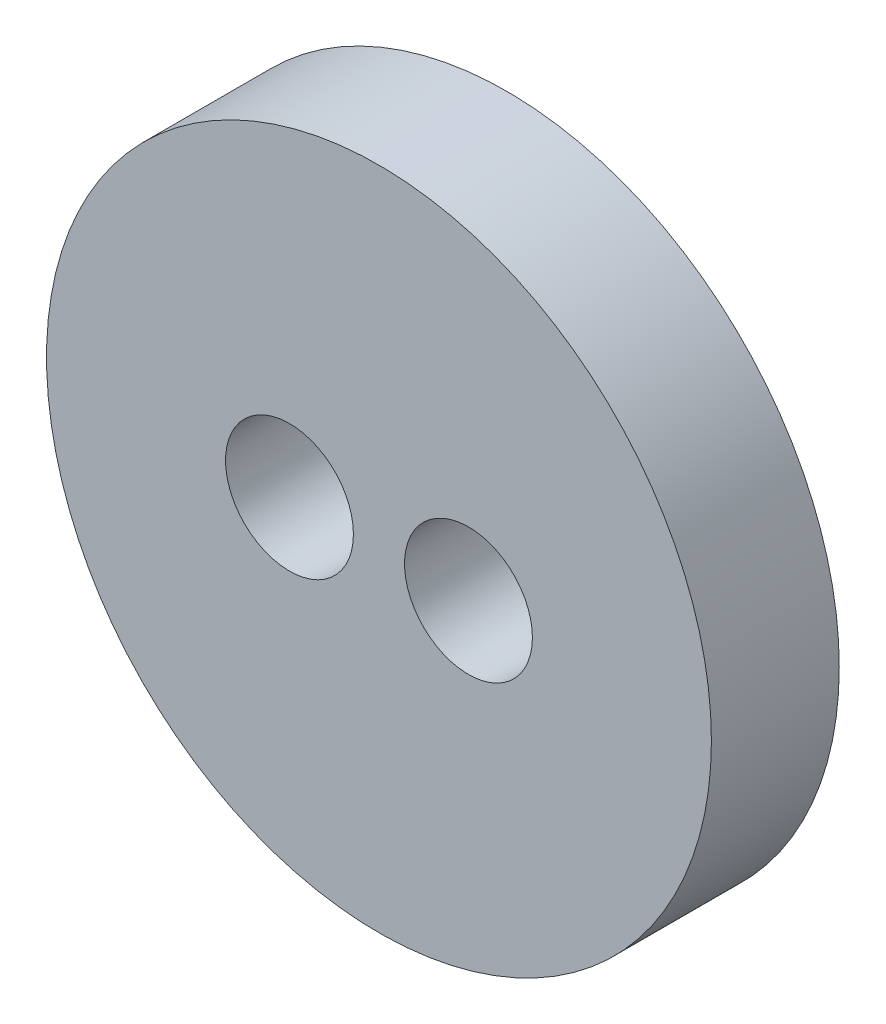
ISO-10303-21;
HEADER;
FILE_DESCRIPTION(('STEP AP214'),'2;1');
FILE_NAME('part.step','',(''),(''),'','','');
FILE_SCHEMA(('AUTOMOTIVE_DESIGN { 1 0 10303 214 1 1 1 1 }'));
ENDSEC;
DATA;
#1=APPLICATION_CONTEXT('core data for automotive mechanical design processes');
#2=APPLICATION_PROTOCOL_DEFINITION('international standard','automotive_design',2000,#1);
#3=PRODUCT_CONTEXT('',#1,'mechanical');
#4=PRODUCT('Part','Part','',(#3));
#5=PRODUCT_RELATED_PRODUCT_CATEGORY('part','',(#4));
#6=PRODUCT_DEFINITION_FORMATION('','',#4);
#7=PRODUCT_DEFINITION_CONTEXT('part definition',#1,'design');
#8=PRODUCT_DEFINITION('design','',#6,#7);
#9=PRODUCT_DEFINITION_SHAPE('','',#8);
#10=(LENGTH_UNIT() NAMED_UNIT(*) SI_UNIT(.MILLI.,.METRE.));
#11=(NAMED_UNIT(*) PLANE_ANGLE_UNIT() SI_UNIT($,.RADIAN.));
#12=(NAMED_UNIT(*) SI_UNIT($,.STERADIAN.) SOLID_ANGLE_UNIT());
#13=UNCERTAINTY_MEASURE_WITH_UNIT(LENGTH_MEASURE(1.E-05),#10,'distance_accuracy_value','');
#14=(GEOMETRIC_REPRESENTATION_CONTEXT(3) GLOBAL_UNCERTAINTY_ASSIGNED_CONTEXT((#13)) GLOBAL_UNIT_ASSIGNED_CONTEXT((#10,
#11,#12)) REPRESENTATION_CONTEXT('',''));
#15=CARTESIAN_POINT('',(0.,0.,0.));
#16=DIRECTION('',(0.,0.,1.));
#17=DIRECTION('',(1.,0.,0.));
#18=AXIS2_PLACEMENT_3D('',#15,#16,#17);
#19=CARTESIAN_POINT('',(0.,0.,2.));
#20=DIRECTION('',(0.,0.,1.));
#21=DIRECTION('',(1.,0.,0.));
#22=AXIS2_PLACEMENT_3D('',#19,#20,#21);
#23=PLANE('',#22);
#24=CARTESIAN_POINT('',(1.4,0.,2.));
#25=DIRECTION('',(0.,0.,1.));
#26=DIRECTION('',(1.,0.,0.));
#27=AXIS2_PLACEMENT_3D('',#24,#25,#26);
#28=CIRCLE('',#27,1.);
#29=CARTESIAN_POINT('',(2.4,0.,2.));
#30=VERTEX_POINT('',#29);
#31=EDGE_CURVE('E52',#30,#30,#28,.T.);
#32=ORIENTED_EDGE('',*,*,#31,.F.);
#33=EDGE_LOOP('',(#32));
#34=FACE_BOUND('',#33,.T.);
#35=CARTESIAN_POINT('',(0.,0.,2.));
#36=DIRECTION('',(0.,0.,1.));
#37=DIRECTION('',(1.,0.,0.));
#38=AXIS2_PLACEMENT_3D('',#35,#36,#37);
#39=CIRCLE('',#38,5.2);
#40=CARTESIAN_POINT('',(5.2,0.,2.));
#41=VERTEX_POINT('',#40);
#42=EDGE_CURVE('E10',#41,#41,#39,.T.);
#43=ORIENTED_EDGE('',*,*,#42,.T.);
#44=EDGE_LOOP('',(#43));
#45=FACE_BOUND('',#44,.T.);
#46=CARTESIAN_POINT('',(-1.4,0.,2.));
#47=DIRECTION('',(0.,0.,1.));
#48=DIRECTION('',(1.,0.,0.));
#49=AXIS2_PLACEMENT_3D('',#46,#47,#48);
#50=CIRCLE('',#49,1.);
#51=CARTESIAN_POINT('',(-0.4,0.,2.));
#52=VERTEX_POINT('',#51);
#53=EDGE_CURVE('E57',#52,#52,#50,.T.);
#54=ORIENTED_EDGE('',*,*,#53,.F.);
#55=EDGE_LOOP('',(#54));
#56=FACE_BOUND('',#55,.T.);
#57=ADVANCED_FACE('F41',(#34,#45,#56),#23,.T.);
#58=CARTESIAN_POINT('',(0.,0.,0.));
#59=DIRECTION('',(0.,0.,1.));
#60=DIRECTION('',(1.,0.,0.));
#61=AXIS2_PLACEMENT_3D('',#58,#59,#60);
#62=PLANE('',#61);
#63=CARTESIAN_POINT('',(0.,0.,0.));
#64=DIRECTION('',(0.,0.,1.));
#65=DIRECTION('',(1.,0.,0.));
#66=AXIS2_PLACEMENT_3D('',#63,#64,#65);
#67=CIRCLE('',#66,5.2);
#68=CARTESIAN_POINT('',(5.2,0.,0.));
#69=VERTEX_POINT('',#68);
#70=EDGE_CURVE('E45',#69,#69,#67,.T.);
#71=ORIENTED_EDGE('',*,*,#70,.F.);
#72=EDGE_LOOP('',(#71));
#73=FACE_BOUND('',#72,.T.);
#74=CARTESIAN_POINT('',(1.4,0.,0.));
#75=DIRECTION('',(0.,0.,1.));
#76=DIRECTION('',(1.,0.,0.));
#77=AXIS2_PLACEMENT_3D('',#74,#75,#76);
#78=CIRCLE('',#77,1.);
#79=CARTESIAN_POINT('',(2.4,0.,0.));
#80=VERTEX_POINT('',#79);
#81=EDGE_CURVE('E54',#80,#80,#78,.T.);
#82=ORIENTED_EDGE('',*,*,#81,.T.);
#83=EDGE_LOOP('',(#82));
#84=FACE_BOUND('',#83,.T.);
#85=CARTESIAN_POINT('',(-1.4,0.,0.));
#86=DIRECTION('',(0.,0.,1.));
#87=DIRECTION('',(1.,0.,0.));
#88=AXIS2_PLACEMENT_3D('',#85,#86,#87);
#89=CIRCLE('',#88,1.);
#90=CARTESIAN_POINT('',(-0.4,0.,0.));
#91=VERTEX_POINT('',#90);
#92=EDGE_CURVE('E60',#91,#91,#89,.T.);
#93=ORIENTED_EDGE('',*,*,#92,.T.);
#94=EDGE_LOOP('',(#93));
#95=FACE_BOUND('',#94,.T.);
#96=ADVANCED_FACE('F70',(#73,#84,#95),#62,.F.);
#97=CARTESIAN_POINT('',(0.,0.,2.));
#98=DIRECTION('',(0.,0.,-1.));
#99=DIRECTION('',(-1.,0.,0.));
#100=AXIS2_PLACEMENT_3D('',#97,#98,#99);
#101=CYLINDRICAL_SURFACE('',#100,5.2);
#102=ORIENTED_EDGE('',*,*,#42,.F.);
#103=EDGE_LOOP('',(#102));
#104=FACE_BOUND('',#103,.T.);
#105=ORIENTED_EDGE('',*,*,#70,.T.);
#106=EDGE_LOOP('',(#105));
#107=FACE_BOUND('',#106,.T.);
#108=ADVANCED_FACE('F43',(#104,#107),#101,.T.);
#109=CARTESIAN_POINT('',(1.4,0.,2.));
#110=DIRECTION('',(0.,0.,-1.));
#111=DIRECTION('',(-1.,0.,0.));
#112=AXIS2_PLACEMENT_3D('',#109,#110,#111);
#113=CYLINDRICAL_SURFACE('',#112,1.);
#114=ORIENTED_EDGE('',*,*,#31,.T.);
#115=EDGE_LOOP('',(#114));
#116=FACE_BOUND('',#115,.T.);
#117=ORIENTED_EDGE('',*,*,#81,.F.);
#118=EDGE_LOOP('',(#117));
#119=FACE_BOUND('',#118,.T.);
#120=ADVANCED_FACE('F79',(#116,#119),#113,.F.);
#121=CARTESIAN_POINT('',(-1.4,0.,2.));
#122=DIRECTION('',(0.,0.,-1.));
#123=DIRECTION('',(-1.,0.,0.));
#124=AXIS2_PLACEMENT_3D('',#121,#122,#123);
#125=CYLINDRICAL_SURFACE('',#124,1.);
#126=ORIENTED_EDGE('',*,*,#53,.T.);
#127=EDGE_LOOP('',(#126));
#128=FACE_BOUND('',#127,.T.);
#129=ORIENTED_EDGE('',*,*,#92,.F.);
#130=EDGE_LOOP('',(#129));
#131=FACE_BOUND('',#130,.T.);
#132=ADVANCED_FACE('F66',(#128,#131),#125,.F.);
#133=CLOSED_SHELL('',(#57,#96,#108,#120,#132));
#134=MANIFOLD_SOLID_BREP('B2',#133);
#135=ADVANCED_BREP_SHAPE_REPRESENTATION('',(#18,#134),#14);
#136=SHAPE_DEFINITION_REPRESENTATION(#9,#135);
ENDSEC;
END-ISO-10303-21;
